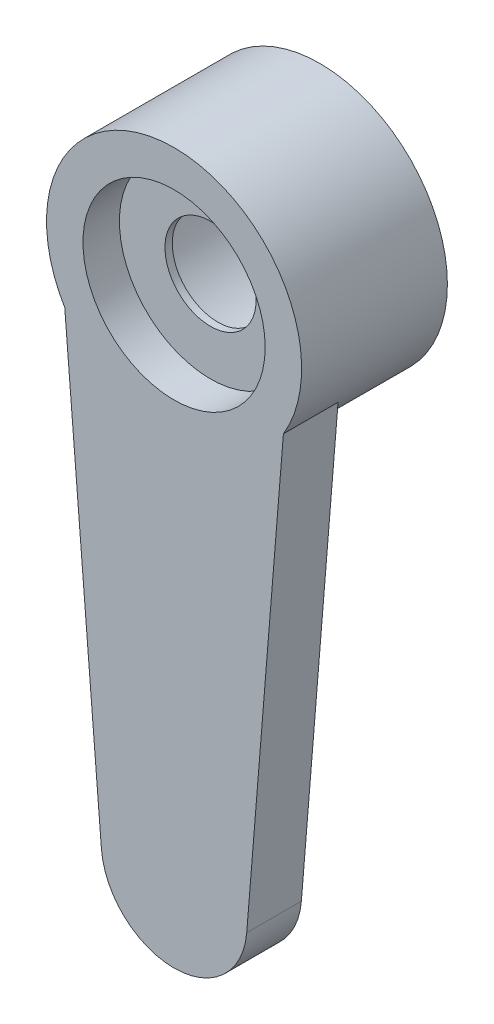
ISO-10303-21;
HEADER;
FILE_DESCRIPTION(('STEP AP214'),'2;1');
FILE_NAME('part.step','',(''),(''),'','','');
FILE_SCHEMA(('AUTOMOTIVE_DESIGN { 1 0 10303 214 1 1 1 1 }'));
ENDSEC;
DATA;
#1=APPLICATION_CONTEXT('core data for automotive mechanical design processes');
#2=APPLICATION_PROTOCOL_DEFINITION('international standard','automotive_design',2000,#1);
#3=PRODUCT_CONTEXT('',#1,'mechanical');
#4=PRODUCT('Part','Part','',(#3));
#5=PRODUCT_RELATED_PRODUCT_CATEGORY('part','',(#4));
#6=PRODUCT_DEFINITION_FORMATION('','',#4);
#7=PRODUCT_DEFINITION_CONTEXT('part definition',#1,'design');
#8=PRODUCT_DEFINITION('design','',#6,#7);
#9=PRODUCT_DEFINITION_SHAPE('','',#8);
#10=(LENGTH_UNIT() NAMED_UNIT(*) SI_UNIT(.MILLI.,.METRE.));
#11=(NAMED_UNIT(*) PLANE_ANGLE_UNIT() SI_UNIT($,.RADIAN.));
#12=(NAMED_UNIT(*) SI_UNIT($,.STERADIAN.) SOLID_ANGLE_UNIT());
#13=UNCERTAINTY_MEASURE_WITH_UNIT(LENGTH_MEASURE(1.E-05),#10,'distance_accuracy_value','');
#14=(GEOMETRIC_REPRESENTATION_CONTEXT(3) GLOBAL_UNCERTAINTY_ASSIGNED_CONTEXT((#13)) GLOBAL_UNIT_ASSIGNED_CONTEXT((#10,
#11,#12)) REPRESENTATION_CONTEXT('',''));
#15=CARTESIAN_POINT('',(0.,0.,0.));
#16=DIRECTION('',(0.,0.,1.));
#17=DIRECTION('',(1.,0.,0.));
#18=AXIS2_PLACEMENT_3D('',#15,#16,#17);
#19=CARTESIAN_POINT('',(0.,0.,3.));
#20=DIRECTION('',(0.,0.,1.));
#21=DIRECTION('',(1.,0.,0.));
#22=AXIS2_PLACEMENT_3D('',#19,#20,#21);
#23=PLANE('',#22);
#24=CARTESIAN_POINT('',(0.,0.,3.));
#25=DIRECTION('',(0.,0.,1.));
#26=DIRECTION('',(1.,0.,0.));
#27=AXIS2_PLACEMENT_3D('',#24,#25,#26);
#28=CIRCLE('',#27,1.25);
#29=CARTESIAN_POINT('',(1.25,0.,3.));
#30=VERTEX_POINT('',#29);
#31=EDGE_CURVE('E119',#30,#30,#28,.T.);
#32=ORIENTED_EDGE('',*,*,#31,.F.);
#33=EDGE_LOOP('',(#32));
#34=FACE_BOUND('',#33,.T.);
#35=CARTESIAN_POINT('',(0.,0.,3.));
#36=DIRECTION('',(0.,0.,1.));
#37=DIRECTION('',(1.,0.,0.));
#38=AXIS2_PLACEMENT_3D('',#35,#36,#37);
#39=CIRCLE('',#38,2.5);
#40=CARTESIAN_POINT('',(2.5,0.,3.));
#41=VERTEX_POINT('',#40);
#42=EDGE_CURVE('E108',#41,#41,#39,.T.);
#43=ORIENTED_EDGE('',*,*,#42,.T.);
#44=EDGE_LOOP('',(#43));
#45=FACE_BOUND('',#44,.T.);
#46=ADVANCED_FACE('F36',(#34,#45),#23,.T.);
#47=CARTESIAN_POINT('',(0.,0.,0.));
#48=DIRECTION('',(0.,0.,1.));
#49=DIRECTION('',(1.,0.,0.));
#50=AXIS2_PLACEMENT_3D('',#47,#48,#49);
#51=PLANE('',#50);
#52=CARTESIAN_POINT('',(0.,0.,0.));
#53=DIRECTION('',(0.,0.,1.));
#54=DIRECTION('',(1.,0.,0.));
#55=AXIS2_PLACEMENT_3D('',#52,#53,#54);
#56=CIRCLE('',#55,3.5);
#57=CARTESIAN_POINT('',(3.5,0.,0.));
#58=VERTEX_POINT('',#57);
#59=EDGE_CURVE('E11',#58,#58,#56,.T.);
#60=ORIENTED_EDGE('',*,*,#59,.F.);
#61=EDGE_LOOP('',(#60));
#62=FACE_BOUND('',#61,.T.);
#63=CARTESIAN_POINT('',(0.,0.,0.));
#64=DIRECTION('',(0.,0.,1.));
#65=DIRECTION('',(1.,0.,0.));
#66=AXIS2_PLACEMENT_3D('',#63,#64,#65);
#67=CIRCLE('',#66,2.5);
#68=CARTESIAN_POINT('',(2.5,0.,0.));
#69=VERTEX_POINT('',#68);
#70=EDGE_CURVE('E44',#69,#69,#67,.T.);
#71=ORIENTED_EDGE('',*,*,#70,.T.);
#72=EDGE_LOOP('',(#71));
#73=FACE_BOUND('',#72,.T.);
#74=ADVANCED_FACE('F129',(#62,#73),#51,.F.);
#75=CARTESIAN_POINT('',(0.,0.,2.8));
#76=DIRECTION('',(0.,0.,-1.));
#77=DIRECTION('',(-1.,0.,0.));
#78=AXIS2_PLACEMENT_3D('',#75,#76,#77);
#79=CYLINDRICAL_SURFACE('',#78,3.5);
#80=CARTESIAN_POINT('',(0.,0.,4.));
#81=DIRECTION('',(0.,0.,1.));
#82=DIRECTION('',(1.,0.,0.));
#83=AXIS2_PLACEMENT_3D('',#80,#81,#82);
#84=CIRCLE('',#83,3.5);
#85=CARTESIAN_POINT('',(3.,-1.80277563773199,4.));
#86=VERTEX_POINT('',#85);
#87=CARTESIAN_POINT('',(-3.,-1.80277563773199,4.));
#88=VERTEX_POINT('',#87);
#89=EDGE_CURVE('E114',#86,#88,#84,.T.);
#90=ORIENTED_EDGE('',*,*,#89,.F.);
#91=DIRECTION('',(0.,0.,1.));
#92=VECTOR('',#91,1.);
#93=CARTESIAN_POINT('',(3.,-1.80277563773199,2.5));
#94=LINE('',#93,#92);
#95=CARTESIAN_POINT('',(3.,-1.80277563773199,2.5));
#96=VERTEX_POINT('',#95);
#97=EDGE_CURVE('E106',#96,#86,#94,.T.);
#98=ORIENTED_EDGE('',*,*,#97,.F.);
#99=CARTESIAN_POINT('',(0.,0.,2.5));
#100=DIRECTION('',(0.,0.,-1.));
#101=DIRECTION('',(1.,0.,0.));
#102=AXIS2_PLACEMENT_3D('',#99,#100,#101);
#103=CIRCLE('',#102,3.5);
#104=CARTESIAN_POINT('',(-3.,-1.80277563773199,2.5));
#105=VERTEX_POINT('',#104);
#106=EDGE_CURVE('E60',#96,#105,#103,.T.);
#107=ORIENTED_EDGE('',*,*,#106,.T.);
#108=DIRECTION('',(0.,0.,1.));
#109=VECTOR('',#108,1.);
#110=CARTESIAN_POINT('',(-3.,-1.80277563773199,2.5));
#111=LINE('',#110,#109);
#112=EDGE_CURVE('E84',#105,#88,#111,.T.);
#113=ORIENTED_EDGE('',*,*,#112,.T.);
#114=EDGE_LOOP('',(#90,#98,#107,#113));
#115=FACE_BOUND('',#114,.T.);
#116=ORIENTED_EDGE('',*,*,#59,.T.);
#117=EDGE_LOOP('',(#116));
#118=FACE_BOUND('',#117,.T.);
#119=ADVANCED_FACE('F38',(#115,#118),#79,.T.);
#120=CARTESIAN_POINT('',(0.,0.,2.8));
#121=DIRECTION('',(0.,0.,-1.));
#122=DIRECTION('',(-1.,0.,0.));
#123=AXIS2_PLACEMENT_3D('',#120,#121,#122);
#124=CYLINDRICAL_SURFACE('',#123,2.5);
#125=CARTESIAN_POINT('',(0.,0.,2.8));
#126=DIRECTION('',(0.,0.,1.));
#127=DIRECTION('',(1.,0.,0.));
#128=AXIS2_PLACEMENT_3D('',#125,#126,#127);
#129=CIRCLE('',#128,2.5);
#130=CARTESIAN_POINT('',(2.5,0.,2.8));
#131=VERTEX_POINT('',#130);
#132=EDGE_CURVE('E122',#131,#131,#129,.T.);
#133=ORIENTED_EDGE('',*,*,#132,.T.);
#134=EDGE_LOOP('',(#133));
#135=FACE_BOUND('',#134,.T.);
#136=ORIENTED_EDGE('',*,*,#70,.F.);
#137=EDGE_LOOP('',(#136));
#138=FACE_BOUND('',#137,.T.);
#139=ADVANCED_FACE('F131',(#135,#138),#124,.F.);
#140=CARTESIAN_POINT('',(0.,0.,2.8));
#141=DIRECTION('',(0.,0.,1.));
#142=DIRECTION('',(1.,0.,0.));
#143=AXIS2_PLACEMENT_3D('',#140,#141,#142);
#144=PLANE('',#143);
#145=CARTESIAN_POINT('',(0.,0.,2.8));
#146=DIRECTION('',(0.,0.,1.));
#147=DIRECTION('',(1.,0.,0.));
#148=AXIS2_PLACEMENT_3D('',#145,#146,#147);
#149=CIRCLE('',#148,1.25);
#150=CARTESIAN_POINT('',(1.25,0.,2.8));
#151=VERTEX_POINT('',#150);
#152=EDGE_CURVE('E118',#151,#151,#149,.T.);
#153=ORIENTED_EDGE('',*,*,#152,.T.);
#154=EDGE_LOOP('',(#153));
#155=FACE_BOUND('',#154,.T.);
#156=ORIENTED_EDGE('',*,*,#132,.F.);
#157=EDGE_LOOP('',(#156));
#158=FACE_BOUND('',#157,.T.);
#159=ADVANCED_FACE('F133',(#155,#158),#144,.F.);
#160=CARTESIAN_POINT('',(0.,0.,3.));
#161=DIRECTION('',(0.,0.,-1.));
#162=DIRECTION('',(-1.,0.,0.));
#163=AXIS2_PLACEMENT_3D('',#160,#161,#162);
#164=CYLINDRICAL_SURFACE('',#163,1.25);
#165=ORIENTED_EDGE('',*,*,#31,.T.);
#166=EDGE_LOOP('',(#165));
#167=FACE_BOUND('',#166,.T.);
#168=ORIENTED_EDGE('',*,*,#152,.F.);
#169=EDGE_LOOP('',(#168));
#170=FACE_BOUND('',#169,.T.);
#171=ADVANCED_FACE('F140',(#167,#170),#164,.F.);
#172=CARTESIAN_POINT('',(0.,0.,4.));
#173=DIRECTION('',(0.,0.,1.));
#174=DIRECTION('',(1.,0.,0.));
#175=AXIS2_PLACEMENT_3D('',#172,#173,#174);
#176=PLANE('',#175);
#177=ORIENTED_EDGE('',*,*,#89,.T.);
#178=DIRECTION('',(0.0811741886151611,-0.996699930321393,0.));
#179=VECTOR('',#178,1.);
#180=CARTESIAN_POINT('',(-3.,-1.80277563773199,4.));
#181=LINE('',#180,#179);
#182=CARTESIAN_POINT('',(-1.99339986064279,-14.1623483772303,4.));
#183=VERTEX_POINT('',#182);
#184=EDGE_CURVE('E102',#88,#183,#181,.T.);
#185=ORIENTED_EDGE('',*,*,#184,.T.);
#186=CARTESIAN_POINT('',(0.,-14.,4.));
#187=DIRECTION('',(0.,0.,1.));
#188=DIRECTION('',(1.,0.,0.));
#189=AXIS2_PLACEMENT_3D('',#186,#187,#188);
#190=CIRCLE('',#189,2.);
#191=CARTESIAN_POINT('',(1.99339986064279,-14.1623483772303,4.));
#192=VERTEX_POINT('',#191);
#193=EDGE_CURVE('E90',#183,#192,#190,.T.);
#194=ORIENTED_EDGE('',*,*,#193,.T.);
#195=DIRECTION('',(0.0811741886151611,0.996699930321393,0.));
#196=VECTOR('',#195,1.);
#197=CARTESIAN_POINT('',(3.,-1.80277563773199,4.));
#198=LINE('',#197,#196);
#199=EDGE_CURVE('E51',#192,#86,#198,.T.);
#200=ORIENTED_EDGE('',*,*,#199,.T.);
#201=EDGE_LOOP('',(#177,#185,#194,#200));
#202=FACE_BOUND('',#201,.T.);
#203=CARTESIAN_POINT('',(0.,0.,4.));
#204=DIRECTION('',(0.,0.,1.));
#205=DIRECTION('',(1.,0.,0.));
#206=AXIS2_PLACEMENT_3D('',#203,#204,#205);
#207=CIRCLE('',#206,2.5);
#208=CARTESIAN_POINT('',(2.5,0.,4.));
#209=VERTEX_POINT('',#208);
#210=EDGE_CURVE('E111',#209,#209,#207,.T.);
#211=ORIENTED_EDGE('',*,*,#210,.F.);
#212=EDGE_LOOP('',(#211));
#213=FACE_BOUND('',#212,.T.);
#214=ADVANCED_FACE('F156',(#202,#213),#176,.T.);
#215=CARTESIAN_POINT('',(0.,0.,4.));
#216=DIRECTION('',(0.,0.,-1.));
#217=DIRECTION('',(-1.,0.,0.));
#218=AXIS2_PLACEMENT_3D('',#215,#216,#217);
#219=CYLINDRICAL_SURFACE('',#218,2.5);
#220=ORIENTED_EDGE('',*,*,#210,.T.);
#221=EDGE_LOOP('',(#220));
#222=FACE_BOUND('',#221,.T.);
#223=ORIENTED_EDGE('',*,*,#42,.F.);
#224=EDGE_LOOP('',(#223));
#225=FACE_BOUND('',#224,.T.);
#226=ADVANCED_FACE('F160',(#222,#225),#219,.F.);
#227=CARTESIAN_POINT('',(3.,-1.80277563773199,2.5));
#228=DIRECTION('',(0.996699930321393,-0.0811741886151611,0.));
#229=DIRECTION('',(0.0811741886151611,0.996699930321393,0.));
#230=AXIS2_PLACEMENT_3D('',#227,#228,#229);
#231=PLANE('',#230);
#232=ORIENTED_EDGE('',*,*,#199,.F.);
#233=DIRECTION('',(0.,0.,1.));
#234=VECTOR('',#233,1.);
#235=CARTESIAN_POINT('',(1.99339986064279,-14.1623483772303,2.5));
#236=LINE('',#235,#234);
#237=CARTESIAN_POINT('',(1.99339986064279,-14.1623483772303,2.5));
#238=VERTEX_POINT('',#237);
#239=EDGE_CURVE('E78',#238,#192,#236,.T.);
#240=ORIENTED_EDGE('',*,*,#239,.F.);
#241=DIRECTION('',(0.0811741886151611,0.996699930321393,0.));
#242=VECTOR('',#241,1.);
#243=CARTESIAN_POINT('',(3.,-1.80277563773199,2.5));
#244=LINE('',#243,#242);
#245=EDGE_CURVE('E95',#238,#96,#244,.T.);
#246=ORIENTED_EDGE('',*,*,#245,.T.);
#247=ORIENTED_EDGE('',*,*,#97,.T.);
#248=EDGE_LOOP('',(#232,#240,#246,#247));
#249=FACE_BOUND('',#248,.T.);
#250=ADVANCED_FACE('F163',(#249),#231,.T.);
#251=CARTESIAN_POINT('',(0.,-14.,2.5));
#252=DIRECTION('',(0.,0.,1.));
#253=DIRECTION('',(1.,0.,0.));
#254=AXIS2_PLACEMENT_3D('',#251,#252,#253);
#255=CYLINDRICAL_SURFACE('',#254,2.);
#256=ORIENTED_EDGE('',*,*,#193,.F.);
#257=DIRECTION('',(0.,0.,1.));
#258=VECTOR('',#257,1.);
#259=CARTESIAN_POINT('',(-1.99339986064279,-14.1623483772303,2.5));
#260=LINE('',#259,#258);
#261=CARTESIAN_POINT('',(-1.99339986064279,-14.1623483772303,2.5));
#262=VERTEX_POINT('',#261);
#263=EDGE_CURVE('E86',#262,#183,#260,.T.);
#264=ORIENTED_EDGE('',*,*,#263,.F.);
#265=CARTESIAN_POINT('',(0.,-14.,2.5));
#266=DIRECTION('',(0.,0.,1.));
#267=DIRECTION('',(1.,0.,0.));
#268=AXIS2_PLACEMENT_3D('',#265,#266,#267);
#269=CIRCLE('',#268,2.);
#270=EDGE_CURVE('E89',#262,#238,#269,.T.);
#271=ORIENTED_EDGE('',*,*,#270,.T.);
#272=ORIENTED_EDGE('',*,*,#239,.T.);
#273=EDGE_LOOP('',(#256,#264,#271,#272));
#274=FACE_BOUND('',#273,.T.);
#275=ADVANCED_FACE('F88',(#274),#255,.T.);
#276=CARTESIAN_POINT('',(-3.,-1.80277563773199,2.5));
#277=DIRECTION('',(-0.996699930321393,-0.0811741886151611,0.));
#278=DIRECTION('',(0.0811741886151611,-0.996699930321393,0.));
#279=AXIS2_PLACEMENT_3D('',#276,#277,#278);
#280=PLANE('',#279);
#281=ORIENTED_EDGE('',*,*,#184,.F.);
#282=ORIENTED_EDGE('',*,*,#112,.F.);
#283=DIRECTION('',(0.0811741886151611,-0.996699930321393,0.));
#284=VECTOR('',#283,1.);
#285=CARTESIAN_POINT('',(-3.,-1.80277563773199,2.5));
#286=LINE('',#285,#284);
#287=EDGE_CURVE('E94',#105,#262,#286,.T.);
#288=ORIENTED_EDGE('',*,*,#287,.T.);
#289=ORIENTED_EDGE('',*,*,#263,.T.);
#290=EDGE_LOOP('',(#281,#282,#288,#289));
#291=FACE_BOUND('',#290,.T.);
#292=ADVANCED_FACE('F97',(#291),#280,.T.);
#293=CARTESIAN_POINT('',(0.,0.,2.5));
#294=DIRECTION('',(0.,0.,1.));
#295=DIRECTION('',(1.,0.,0.));
#296=AXIS2_PLACEMENT_3D('',#293,#294,#295);
#297=PLANE('',#296);
#298=ORIENTED_EDGE('',*,*,#106,.F.);
#299=ORIENTED_EDGE('',*,*,#245,.F.);
#300=ORIENTED_EDGE('',*,*,#270,.F.);
#301=ORIENTED_EDGE('',*,*,#287,.F.);
#302=EDGE_LOOP('',(#298,#299,#300,#301));
#303=FACE_BOUND('',#302,.T.);
#304=ADVANCED_FACE('F93',(#303),#297,.F.);
#305=CLOSED_SHELL('',(#46,#74,#119,#139,#159,#171,#214,#226,#250,#275,#292,#304));
#306=MANIFOLD_SOLID_BREP('B2',#305);
#307=ADVANCED_BREP_SHAPE_REPRESENTATION('',(#18,#306),#14);
#308=SHAPE_DEFINITION_REPRESENTATION(#9,#307);
ENDSEC;
END-ISO-10303-21;
